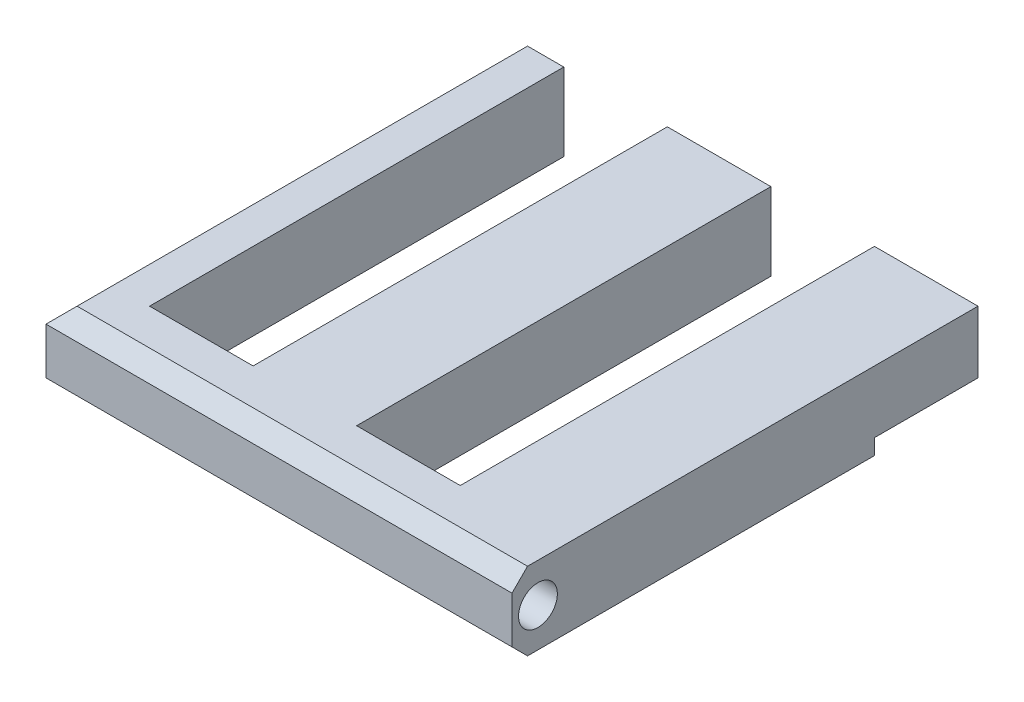
ISO-10303-21;
HEADER;
FILE_DESCRIPTION(('STEP AP214'),'2;1');
FILE_NAME('part.step','',(''),(''),'','','');
FILE_SCHEMA(('AUTOMOTIVE_DESIGN { 1 0 10303 214 1 1 1 1 }'));
ENDSEC;
DATA;
#1=APPLICATION_CONTEXT('core data for automotive mechanical design processes');
#2=APPLICATION_PROTOCOL_DEFINITION('international standard','automotive_design',2000,#1);
#3=PRODUCT_CONTEXT('',#1,'mechanical');
#4=PRODUCT('Part','Part','',(#3));
#5=PRODUCT_RELATED_PRODUCT_CATEGORY('part','',(#4));
#6=PRODUCT_DEFINITION_FORMATION('','',#4);
#7=PRODUCT_DEFINITION_CONTEXT('part definition',#1,'design');
#8=PRODUCT_DEFINITION('design','',#6,#7);
#9=PRODUCT_DEFINITION_SHAPE('','',#8);
#10=(LENGTH_UNIT() NAMED_UNIT(*) SI_UNIT(.MILLI.,.METRE.));
#11=(NAMED_UNIT(*) PLANE_ANGLE_UNIT() SI_UNIT($,.RADIAN.));
#12=(NAMED_UNIT(*) SI_UNIT($,.STERADIAN.) SOLID_ANGLE_UNIT());
#13=UNCERTAINTY_MEASURE_WITH_UNIT(LENGTH_MEASURE(1.E-05),#10,'distance_accuracy_value','');
#14=(GEOMETRIC_REPRESENTATION_CONTEXT(3) GLOBAL_UNCERTAINTY_ASSIGNED_CONTEXT((#13)) GLOBAL_UNIT_ASSIGNED_CONTEXT((#10,
#11,#12)) REPRESENTATION_CONTEXT('',''));
#15=CARTESIAN_POINT('',(0.,0.,0.));
#16=DIRECTION('',(0.,0.,1.));
#17=DIRECTION('',(1.,0.,0.));
#18=AXIS2_PLACEMENT_3D('',#15,#16,#17);
#19=CARTESIAN_POINT('',(0.,38.1,0.));
#20=DIRECTION('',(-1.,0.,0.));
#21=DIRECTION('',(0.,0.,1.));
#22=AXIS2_PLACEMENT_3D('',#19,#20,#21);
#23=PLANE('',#22);
#24=CARTESIAN_POINT('',(0.,19.05,-12.7289710029541));
#25=DIRECTION('',(1.,0.,0.));
#26=DIRECTION('',(0.,0.,-1.));
#27=AXIS2_PLACEMENT_3D('',#24,#25,#26);
#28=CIRCLE('',#27,9.525);
#29=CARTESIAN_POINT('',(0.,19.05,-22.2539710029541));
#30=VERTEX_POINT('',#29);
#31=EDGE_CURVE('E195',#30,#30,#28,.T.);
#32=ORIENTED_EDGE('',*,*,#31,.F.);
#33=EDGE_LOOP('',(#32));
#34=FACE_BOUND('',#33,.T.);
#35=DIRECTION('',(0.,0.,-1.));
#36=VECTOR('',#35,1.);
#37=CARTESIAN_POINT('',(0.,38.1,0.));
#38=LINE('',#37,#36);
#39=CARTESIAN_POINT('',(0.,38.1,-7.62000000000004));
#40=VERTEX_POINT('',#39);
#41=CARTESIAN_POINT('',(0.,38.1,-228.6));
#42=VERTEX_POINT('',#41);
#43=EDGE_CURVE('E225',#40,#42,#38,.T.);
#44=ORIENTED_EDGE('',*,*,#43,.F.);
#45=DIRECTION('',(0.,0.707106781186545,-0.70710678118655));
#46=VECTOR('',#45,1.);
#47=CARTESIAN_POINT('',(0.,30.48,0.));
#48=LINE('',#47,#46);
#49=CARTESIAN_POINT('',(0.,30.48,0.));
#50=VERTEX_POINT('',#49);
#51=EDGE_CURVE('E289',#40,#50,#48,.F.);
#52=ORIENTED_EDGE('',*,*,#51,.T.);
#53=DIRECTION('',(0.,-1.,0.));
#54=VECTOR('',#53,1.);
#55=CARTESIAN_POINT('',(0.,38.1,0.));
#56=LINE('',#55,#54);
#57=CARTESIAN_POINT('',(0.,7.62000000000005,0.));
#58=VERTEX_POINT('',#57);
#59=EDGE_CURVE('E251',#50,#58,#56,.T.);
#60=ORIENTED_EDGE('',*,*,#59,.T.);
#61=DIRECTION('',(0.,-0.70710678118655,-0.707106781186545));
#62=VECTOR('',#61,1.);
#63=CARTESIAN_POINT('',(0.,0.,-7.61999999999999));
#64=LINE('',#63,#62);
#65=CARTESIAN_POINT('',(0.,0.,-7.61999999999999));
#66=VERTEX_POINT('',#65);
#67=EDGE_CURVE('E287',#58,#66,#64,.T.);
#68=ORIENTED_EDGE('',*,*,#67,.T.);
#69=DIRECTION('',(0.,0.,-1.));
#70=VECTOR('',#69,1.);
#71=CARTESIAN_POINT('',(0.,0.,0.));
#72=LINE('',#71,#70);
#73=CARTESIAN_POINT('',(0.,0.,-177.771028997046));
#74=VERTEX_POINT('',#73);
#75=EDGE_CURVE('E245',#66,#74,#72,.T.);
#76=ORIENTED_EDGE('',*,*,#75,.T.);
#77=DIRECTION('',(0.,1.,0.));
#78=VECTOR('',#77,1.);
#79=CARTESIAN_POINT('',(0.,38.0999999999999,-177.771028997046));
#80=LINE('',#79,#78);
#81=CARTESIAN_POINT('',(0.,7.61999999999994,-177.771028997046));
#82=VERTEX_POINT('',#81);
#83=EDGE_CURVE('E192',#74,#82,#80,.T.);
#84=ORIENTED_EDGE('',*,*,#83,.T.);
#85=DIRECTION('',(0.,0.,1.));
#86=VECTOR('',#85,1.);
#87=CARTESIAN_POINT('',(0.,7.61999999999994,-177.771028997046));
#88=LINE('',#87,#86);
#89=CARTESIAN_POINT('',(0.,7.61999999999991,-228.6));
#90=VERTEX_POINT('',#89);
#91=EDGE_CURVE('E179',#90,#82,#88,.T.);
#92=ORIENTED_EDGE('',*,*,#91,.F.);
#93=DIRECTION('',(0.,-1.,0.));
#94=VECTOR('',#93,1.);
#95=CARTESIAN_POINT('',(0.,38.1,-228.6));
#96=LINE('',#95,#94);
#97=EDGE_CURVE('E170',#42,#90,#96,.T.);
#98=ORIENTED_EDGE('',*,*,#97,.F.);
#99=EDGE_LOOP('',(#44,#52,#60,#68,#76,#84,#92,#98));
#100=FACE_BOUND('',#99,.T.);
#101=ADVANCED_FACE('F37',(#34,#100),#23,.F.);
#102=CARTESIAN_POINT('',(-50.8,38.1,0.));
#103=DIRECTION('',(-1.,0.,0.));
#104=DIRECTION('',(0.,0.,1.));
#105=AXIS2_PLACEMENT_3D('',#102,#103,#104);
#106=PLANE('',#105);
#107=DIRECTION('',(0.,1.,0.));
#108=VECTOR('',#107,1.);
#109=CARTESIAN_POINT('',(-50.8,38.0999999999999,-177.771028997046));
#110=LINE('',#109,#108);
#111=CARTESIAN_POINT('',(-50.8,0.,-177.771028997046));
#112=VERTEX_POINT('',#111);
#113=CARTESIAN_POINT('',(-50.8,7.61999999999995,-177.771028997046));
#114=VERTEX_POINT('',#113);
#115=EDGE_CURVE('E276',#112,#114,#110,.T.);
#116=ORIENTED_EDGE('',*,*,#115,.F.);
#117=DIRECTION('',(0.,0.,-1.));
#118=VECTOR('',#117,1.);
#119=CARTESIAN_POINT('',(-50.8,0.,0.));
#120=LINE('',#119,#118);
#121=CARTESIAN_POINT('',(-50.8,0.,-25.4));
#122=VERTEX_POINT('',#121);
#123=EDGE_CURVE('E212',#122,#112,#120,.T.);
#124=ORIENTED_EDGE('',*,*,#123,.F.);
#125=DIRECTION('',(0.,-1.,0.));
#126=VECTOR('',#125,1.);
#127=CARTESIAN_POINT('',(-50.8,38.1,-25.4));
#128=LINE('',#127,#126);
#129=CARTESIAN_POINT('',(-50.8,38.1,-25.4));
#130=VERTEX_POINT('',#129);
#131=EDGE_CURVE('E171',#130,#122,#128,.T.);
#132=ORIENTED_EDGE('',*,*,#131,.F.);
#133=DIRECTION('',(0.,0.,-1.));
#134=VECTOR('',#133,1.);
#135=CARTESIAN_POINT('',(-50.8,38.1,0.));
#136=LINE('',#135,#134);
#137=CARTESIAN_POINT('',(-50.8,38.1,-228.6));
#138=VERTEX_POINT('',#137);
#139=EDGE_CURVE('E167',#130,#138,#136,.T.);
#140=ORIENTED_EDGE('',*,*,#139,.T.);
#141=DIRECTION('',(0.,-1.,0.));
#142=VECTOR('',#141,1.);
#143=CARTESIAN_POINT('',(-50.8,38.1,-228.6));
#144=LINE('',#143,#142);
#145=CARTESIAN_POINT('',(-50.8,7.61999999999992,-228.6));
#146=VERTEX_POINT('',#145);
#147=EDGE_CURVE('E160',#138,#146,#144,.T.);
#148=ORIENTED_EDGE('',*,*,#147,.T.);
#149=DIRECTION('',(0.,0.,-1.));
#150=VECTOR('',#149,1.);
#151=CARTESIAN_POINT('',(-50.8,7.61999999999995,-177.771028997046));
#152=LINE('',#151,#150);
#153=EDGE_CURVE('E164',#114,#146,#152,.T.);
#154=ORIENTED_EDGE('',*,*,#153,.F.);
#155=EDGE_LOOP('',(#116,#124,#132,#140,#148,#154));
#156=FACE_BOUND('',#155,.T.);
#157=ADVANCED_FACE('F162',(#156),#106,.T.);
#158=CARTESIAN_POINT('',(0.,0.,0.));
#159=DIRECTION('',(0.,1.,0.));
#160=DIRECTION('',(0.,0.,1.));
#161=AXIS2_PLACEMENT_3D('',#158,#159,#160);
#162=PLANE('',#161);
#163=ORIENTED_EDGE('',*,*,#75,.F.);
#164=DIRECTION('',(-1.,0.,0.));
#165=VECTOR('',#164,1.);
#166=CARTESIAN_POINT('',(-228.6,0.,-7.61999999999997));
#167=LINE('',#166,#165);
#168=CARTESIAN_POINT('',(-220.98,0.,-7.61999999999997));
#169=VERTEX_POINT('',#168);
#170=EDGE_CURVE('E11',#66,#169,#167,.T.);
#171=ORIENTED_EDGE('',*,*,#170,.T.);
#172=DIRECTION('',(0.,0.,-1.));
#173=VECTOR('',#172,1.);
#174=CARTESIAN_POINT('',(-220.98,0.,-228.6));
#175=LINE('',#174,#173);
#176=CARTESIAN_POINT('',(-220.98,0.,-228.6));
#177=VERTEX_POINT('',#176);
#178=EDGE_CURVE('E47',#169,#177,#175,.T.);
#179=ORIENTED_EDGE('',*,*,#178,.T.);
#180=DIRECTION('',(-1.,0.,0.));
#181=VECTOR('',#180,1.);
#182=CARTESIAN_POINT('',(0.,0.,-228.6));
#183=LINE('',#182,#181);
#184=CARTESIAN_POINT('',(-203.2,0.,-228.6));
#185=VERTEX_POINT('',#184);
#186=EDGE_CURVE('E243',#185,#177,#183,.T.);
#187=ORIENTED_EDGE('',*,*,#186,.F.);
#188=DIRECTION('',(0.,0.,-1.));
#189=VECTOR('',#188,1.);
#190=CARTESIAN_POINT('',(-203.2,0.,0.));
#191=LINE('',#190,#189);
#192=CARTESIAN_POINT('',(-203.2,0.,-25.4));
#193=VERTEX_POINT('',#192);
#194=EDGE_CURVE('E241',#193,#185,#191,.T.);
#195=ORIENTED_EDGE('',*,*,#194,.F.);
#196=DIRECTION('',(-1.,0.,0.));
#197=VECTOR('',#196,1.);
#198=CARTESIAN_POINT('',(0.,0.,-25.4));
#199=LINE('',#198,#197);
#200=CARTESIAN_POINT('',(-152.4,0.,-25.4));
#201=VERTEX_POINT('',#200);
#202=EDGE_CURVE('E233',#201,#193,#199,.T.);
#203=ORIENTED_EDGE('',*,*,#202,.F.);
#204=DIRECTION('',(0.,0.,-1.));
#205=VECTOR('',#204,1.);
#206=CARTESIAN_POINT('',(-152.4,0.,0.));
#207=LINE('',#206,#205);
#208=CARTESIAN_POINT('',(-152.4,0.,-228.6));
#209=VERTEX_POINT('',#208);
#210=EDGE_CURVE('E238',#201,#209,#207,.T.);
#211=ORIENTED_EDGE('',*,*,#210,.T.);
#212=DIRECTION('',(-1.,0.,0.));
#213=VECTOR('',#212,1.);
#214=CARTESIAN_POINT('',(0.,0.,-228.6));
#215=LINE('',#214,#213);
#216=CARTESIAN_POINT('',(-101.6,0.,-228.6));
#217=VERTEX_POINT('',#216);
#218=EDGE_CURVE('E235',#217,#209,#215,.T.);
#219=ORIENTED_EDGE('',*,*,#218,.F.);
#220=DIRECTION('',(0.,0.,-1.));
#221=VECTOR('',#220,1.);
#222=CARTESIAN_POINT('',(-101.6,0.,0.));
#223=LINE('',#222,#221);
#224=CARTESIAN_POINT('',(-101.6,0.,-25.4));
#225=VERTEX_POINT('',#224);
#226=EDGE_CURVE('E232',#225,#217,#223,.T.);
#227=ORIENTED_EDGE('',*,*,#226,.F.);
#228=EDGE_CURVE('E205',#122,#225,#199,.T.);
#229=ORIENTED_EDGE('',*,*,#228,.F.);
#230=ORIENTED_EDGE('',*,*,#123,.T.);
#231=DIRECTION('',(-1.,0.,0.));
#232=VECTOR('',#231,1.);
#233=CARTESIAN_POINT('',(0.,0.,-177.771028997046));
#234=LINE('',#233,#232);
#235=EDGE_CURVE('E189',#74,#112,#234,.T.);
#236=ORIENTED_EDGE('',*,*,#235,.F.);
#237=EDGE_LOOP('',(#163,#171,#179,#187,#195,#203,#211,#219,#227,#229,#230,#236));
#238=FACE_BOUND('',#237,.T.);
#239=ADVANCED_FACE('F348',(#238),#162,.F.);
#240=CARTESIAN_POINT('',(0.,38.1,-25.4));
#241=DIRECTION('',(0.,0.,1.));
#242=DIRECTION('',(1.,0.,0.));
#243=AXIS2_PLACEMENT_3D('',#240,#241,#242);
#244=PLANE('',#243);
#245=ORIENTED_EDGE('',*,*,#228,.T.);
#246=DIRECTION('',(0.,-1.,0.));
#247=VECTOR('',#246,1.);
#248=CARTESIAN_POINT('',(-101.6,38.1,-25.4));
#249=LINE('',#248,#247);
#250=CARTESIAN_POINT('',(-101.6,38.1,-25.4));
#251=VERTEX_POINT('',#250);
#252=EDGE_CURVE('E273',#251,#225,#249,.T.);
#253=ORIENTED_EDGE('',*,*,#252,.F.);
#254=DIRECTION('',(-1.,0.,0.));
#255=VECTOR('',#254,1.);
#256=CARTESIAN_POINT('',(0.,38.1,-25.4));
#257=LINE('',#256,#255);
#258=EDGE_CURVE('E208',#130,#251,#257,.T.);
#259=ORIENTED_EDGE('',*,*,#258,.F.);
#260=ORIENTED_EDGE('',*,*,#131,.T.);
#261=EDGE_LOOP('',(#245,#253,#259,#260));
#262=FACE_BOUND('',#261,.T.);
#263=ADVANCED_FACE('F325',(#262),#244,.F.);
#264=CARTESIAN_POINT('',(-101.6,38.1,0.));
#265=DIRECTION('',(-1.,0.,0.));
#266=DIRECTION('',(0.,0.,1.));
#267=AXIS2_PLACEMENT_3D('',#264,#265,#266);
#268=PLANE('',#267);
#269=ORIENTED_EDGE('',*,*,#226,.T.);
#270=DIRECTION('',(0.,-1.,0.));
#271=VECTOR('',#270,1.);
#272=CARTESIAN_POINT('',(-101.6,38.1,-228.6));
#273=LINE('',#272,#271);
#274=CARTESIAN_POINT('',(-101.6,38.1,-228.6));
#275=VERTEX_POINT('',#274);
#276=EDGE_CURVE('E270',#275,#217,#273,.T.);
#277=ORIENTED_EDGE('',*,*,#276,.F.);
#278=DIRECTION('',(0.,0.,-1.));
#279=VECTOR('',#278,1.);
#280=CARTESIAN_POINT('',(-101.6,38.1,0.));
#281=LINE('',#280,#279);
#282=EDGE_CURVE('E211',#251,#275,#281,.T.);
#283=ORIENTED_EDGE('',*,*,#282,.F.);
#284=ORIENTED_EDGE('',*,*,#252,.T.);
#285=EDGE_LOOP('',(#269,#277,#283,#284));
#286=FACE_BOUND('',#285,.T.);
#287=ADVANCED_FACE('F328',(#286),#268,.F.);
#288=CARTESIAN_POINT('',(0.,38.1,-228.6));
#289=DIRECTION('',(0.,0.,1.));
#290=DIRECTION('',(1.,0.,0.));
#291=AXIS2_PLACEMENT_3D('',#288,#289,#290);
#292=PLANE('',#291);
#293=ORIENTED_EDGE('',*,*,#218,.T.);
#294=DIRECTION('',(0.,-1.,0.));
#295=VECTOR('',#294,1.);
#296=CARTESIAN_POINT('',(-152.4,38.1,-228.6));
#297=LINE('',#296,#295);
#298=CARTESIAN_POINT('',(-152.4,38.1,-228.6));
#299=VERTEX_POINT('',#298);
#300=EDGE_CURVE('E268',#299,#209,#297,.T.);
#301=ORIENTED_EDGE('',*,*,#300,.F.);
#302=DIRECTION('',(-1.,0.,0.));
#303=VECTOR('',#302,1.);
#304=CARTESIAN_POINT('',(0.,38.1,-228.6));
#305=LINE('',#304,#303);
#306=EDGE_CURVE('E215',#275,#299,#305,.T.);
#307=ORIENTED_EDGE('',*,*,#306,.F.);
#308=ORIENTED_EDGE('',*,*,#276,.T.);
#309=EDGE_LOOP('',(#293,#301,#307,#308));
#310=FACE_BOUND('',#309,.T.);
#311=ADVANCED_FACE('F333',(#310),#292,.F.);
#312=CARTESIAN_POINT('',(-152.4,38.1,0.));
#313=DIRECTION('',(-1.,0.,0.));
#314=DIRECTION('',(0.,0.,1.));
#315=AXIS2_PLACEMENT_3D('',#312,#313,#314);
#316=PLANE('',#315);
#317=ORIENTED_EDGE('',*,*,#210,.F.);
#318=DIRECTION('',(0.,-1.,0.));
#319=VECTOR('',#318,1.);
#320=CARTESIAN_POINT('',(-152.4,38.1,-25.4));
#321=LINE('',#320,#319);
#322=CARTESIAN_POINT('',(-152.4,38.1,-25.4));
#323=VERTEX_POINT('',#322);
#324=EDGE_CURVE('E266',#323,#201,#321,.T.);
#325=ORIENTED_EDGE('',*,*,#324,.F.);
#326=DIRECTION('',(0.,0.,-1.));
#327=VECTOR('',#326,1.);
#328=CARTESIAN_POINT('',(-152.4,38.1,0.));
#329=LINE('',#328,#327);
#330=EDGE_CURVE('E217',#323,#299,#329,.T.);
#331=ORIENTED_EDGE('',*,*,#330,.T.);
#332=ORIENTED_EDGE('',*,*,#300,.T.);
#333=EDGE_LOOP('',(#317,#325,#331,#332));
#334=FACE_BOUND('',#333,.T.);
#335=ADVANCED_FACE('F339',(#334),#316,.T.);
#336=ORIENTED_EDGE('',*,*,#202,.T.);
#337=DIRECTION('',(0.,-1.,0.));
#338=VECTOR('',#337,1.);
#339=CARTESIAN_POINT('',(-203.2,38.1,-25.4));
#340=LINE('',#339,#338);
#341=CARTESIAN_POINT('',(-203.2,38.1,-25.4));
#342=VERTEX_POINT('',#341);
#343=EDGE_CURVE('E263',#342,#193,#340,.T.);
#344=ORIENTED_EDGE('',*,*,#343,.F.);
#345=EDGE_CURVE('E213',#323,#342,#257,.T.);
#346=ORIENTED_EDGE('',*,*,#345,.F.);
#347=ORIENTED_EDGE('',*,*,#324,.T.);
#348=EDGE_LOOP('',(#336,#344,#346,#347));
#349=FACE_BOUND('',#348,.T.);
#350=ADVANCED_FACE('F342',(#349),#244,.F.);
#351=CARTESIAN_POINT('',(-203.2,38.1,0.));
#352=DIRECTION('',(-1.,0.,0.));
#353=DIRECTION('',(0.,0.,1.));
#354=AXIS2_PLACEMENT_3D('',#351,#352,#353);
#355=PLANE('',#354);
#356=ORIENTED_EDGE('',*,*,#194,.T.);
#357=DIRECTION('',(0.,-1.,0.));
#358=VECTOR('',#357,1.);
#359=CARTESIAN_POINT('',(-203.2,38.1,-228.6));
#360=LINE('',#359,#358);
#361=CARTESIAN_POINT('',(-203.2,38.1,-228.6));
#362=VERTEX_POINT('',#361);
#363=EDGE_CURVE('E260',#362,#185,#360,.T.);
#364=ORIENTED_EDGE('',*,*,#363,.F.);
#365=DIRECTION('',(0.,0.,-1.));
#366=VECTOR('',#365,1.);
#367=CARTESIAN_POINT('',(-203.2,38.1,0.));
#368=LINE('',#367,#366);
#369=EDGE_CURVE('E220',#342,#362,#368,.T.);
#370=ORIENTED_EDGE('',*,*,#369,.F.);
#371=ORIENTED_EDGE('',*,*,#343,.T.);
#372=EDGE_LOOP('',(#356,#364,#370,#371));
#373=FACE_BOUND('',#372,.T.);
#374=ADVANCED_FACE('F345',(#373),#355,.F.);
#375=CARTESIAN_POINT('',(0.,38.1,-228.6));
#376=DIRECTION('',(0.,0.,1.));
#377=DIRECTION('',(1.,0.,0.));
#378=AXIS2_PLACEMENT_3D('',#375,#376,#377);
#379=PLANE('',#378);
#380=CARTESIAN_POINT('',(-215.9,19.05,-228.6));
#381=DIRECTION('',(0.,0.,-1.));
#382=DIRECTION('',(-1.,0.,0.));
#383=AXIS2_PLACEMENT_3D('',#380,#381,#382);
#384=CIRCLE('',#383,9.525);
#385=CARTESIAN_POINT('',(-225.425,19.05,-228.6));
#386=VERTEX_POINT('',#385);
#387=EDGE_CURVE('E199',#386,#386,#384,.T.);
#388=ORIENTED_EDGE('',*,*,#387,.F.);
#389=EDGE_LOOP('',(#388));
#390=FACE_BOUND('',#389,.T.);
#391=DIRECTION('',(0.,-1.,0.));
#392=VECTOR('',#391,1.);
#393=CARTESIAN_POINT('',(-228.6,38.1,-228.6));
#394=LINE('',#393,#392);
#395=CARTESIAN_POINT('',(-228.6,30.48,-228.6));
#396=VERTEX_POINT('',#395);
#397=CARTESIAN_POINT('',(-228.6,7.62000000000005,-228.6));
#398=VERTEX_POINT('',#397);
#399=EDGE_CURVE('E257',#396,#398,#394,.T.);
#400=ORIENTED_EDGE('',*,*,#399,.F.);
#401=DIRECTION('',(-0.707106781186549,-0.707106781186546,0.));
#402=VECTOR('',#401,1.);
#403=CARTESIAN_POINT('',(-228.6,30.48,-228.6));
#404=LINE('',#403,#402);
#405=CARTESIAN_POINT('',(-220.98,38.1,-228.6));
#406=VERTEX_POINT('',#405);
#407=EDGE_CURVE('E297',#396,#406,#404,.F.);
#408=ORIENTED_EDGE('',*,*,#407,.T.);
#409=DIRECTION('',(-1.,0.,0.));
#410=VECTOR('',#409,1.);
#411=CARTESIAN_POINT('',(0.,38.1,-228.6));
#412=LINE('',#411,#410);
#413=EDGE_CURVE('E222',#362,#406,#412,.T.);
#414=ORIENTED_EDGE('',*,*,#413,.F.);
#415=ORIENTED_EDGE('',*,*,#363,.T.);
#416=ORIENTED_EDGE('',*,*,#186,.T.);
#417=DIRECTION('',(-0.707106781186544,0.707106781186551,0.));
#418=VECTOR('',#417,1.);
#419=CARTESIAN_POINT('',(-220.98,0.,-228.6));
#420=LINE('',#419,#418);
#421=EDGE_CURVE('E295',#177,#398,#420,.T.);
#422=ORIENTED_EDGE('',*,*,#421,.T.);
#423=EDGE_LOOP('',(#400,#408,#414,#415,#416,#422));
#424=FACE_BOUND('',#423,.T.);
#425=ADVANCED_FACE('F303',(#390,#424),#379,.F.);
#426=CARTESIAN_POINT('',(-228.6,38.1,0.));
#427=DIRECTION('',(-1.,0.,0.));
#428=DIRECTION('',(0.,0.,1.));
#429=AXIS2_PLACEMENT_3D('',#426,#427,#428);
#430=PLANE('',#429);
#431=DIRECTION('',(0.,-1.,0.));
#432=VECTOR('',#431,1.);
#433=CARTESIAN_POINT('',(-228.6,38.1,0.));
#434=LINE('',#433,#432);
#435=CARTESIAN_POINT('',(-228.6,30.48,0.));
#436=VERTEX_POINT('',#435);
#437=CARTESIAN_POINT('',(-228.6,7.62000000000005,0.));
#438=VERTEX_POINT('',#437);
#439=EDGE_CURVE('E254',#436,#438,#434,.T.);
#440=ORIENTED_EDGE('',*,*,#439,.F.);
#441=DIRECTION('',(0.,0.,-1.));
#442=VECTOR('',#441,1.);
#443=CARTESIAN_POINT('',(-228.6,30.48,0.));
#444=LINE('',#443,#442);
#445=EDGE_CURVE('E293',#436,#396,#444,.T.);
#446=ORIENTED_EDGE('',*,*,#445,.T.);
#447=ORIENTED_EDGE('',*,*,#399,.T.);
#448=DIRECTION('',(0.,0.,1.));
#449=VECTOR('',#448,1.);
#450=CARTESIAN_POINT('',(-228.6,7.62000000000004,0.));
#451=LINE('',#450,#449);
#452=EDGE_CURVE('E291',#398,#438,#451,.T.);
#453=ORIENTED_EDGE('',*,*,#452,.T.);
#454=EDGE_LOOP('',(#440,#446,#447,#453));
#455=FACE_BOUND('',#454,.T.);
#456=ADVANCED_FACE('F360',(#455),#430,.T.);
#457=CARTESIAN_POINT('',(0.,38.1,0.));
#458=DIRECTION('',(0.,0.,1.));
#459=DIRECTION('',(1.,0.,0.));
#460=AXIS2_PLACEMENT_3D('',#457,#458,#459);
#461=PLANE('',#460);
#462=ORIENTED_EDGE('',*,*,#59,.F.);
#463=DIRECTION('',(-1.,0.,0.));
#464=VECTOR('',#463,1.);
#465=CARTESIAN_POINT('',(0.,30.48,0.));
#466=LINE('',#465,#464);
#467=EDGE_CURVE('E280',#50,#436,#466,.T.);
#468=ORIENTED_EDGE('',*,*,#467,.T.);
#469=ORIENTED_EDGE('',*,*,#439,.T.);
#470=DIRECTION('',(1.,0.,0.));
#471=VECTOR('',#470,1.);
#472=CARTESIAN_POINT('',(0.,7.62000000000004,0.));
#473=LINE('',#472,#471);
#474=EDGE_CURVE('E278',#438,#58,#473,.T.);
#475=ORIENTED_EDGE('',*,*,#474,.T.);
#476=EDGE_LOOP('',(#462,#468,#469,#475));
#477=FACE_BOUND('',#476,.T.);
#478=ADVANCED_FACE('F357',(#477),#461,.T.);
#479=CARTESIAN_POINT('',(0.,38.1,-228.6));
#480=DIRECTION('',(0.,0.,1.));
#481=DIRECTION('',(1.,0.,0.));
#482=AXIS2_PLACEMENT_3D('',#479,#480,#481);
#483=PLANE('',#482);
#484=ORIENTED_EDGE('',*,*,#97,.T.);
#485=DIRECTION('',(1.,0.,0.));
#486=VECTOR('',#485,1.);
#487=CARTESIAN_POINT('',(-50.8,7.61999999999992,-228.6));
#488=LINE('',#487,#486);
#489=EDGE_CURVE('E174',#146,#90,#488,.T.);
#490=ORIENTED_EDGE('',*,*,#489,.F.);
#491=ORIENTED_EDGE('',*,*,#147,.F.);
#492=DIRECTION('',(-1.,0.,0.));
#493=VECTOR('',#492,1.);
#494=CARTESIAN_POINT('',(0.,38.1,-228.6));
#495=LINE('',#494,#493);
#496=EDGE_CURVE('E227',#42,#138,#495,.T.);
#497=ORIENTED_EDGE('',*,*,#496,.F.);
#498=EDGE_LOOP('',(#484,#490,#491,#497));
#499=FACE_BOUND('',#498,.T.);
#500=ADVANCED_FACE('F175',(#499),#483,.F.);
#501=CARTESIAN_POINT('',(0.,38.1,0.));
#502=DIRECTION('',(0.,1.,0.));
#503=DIRECTION('',(0.,0.,1.));
#504=AXIS2_PLACEMENT_3D('',#501,#502,#503);
#505=PLANE('',#504);
#506=DIRECTION('',(0.,0.,1.));
#507=VECTOR('',#506,1.);
#508=CARTESIAN_POINT('',(-220.98,38.1,0.));
#509=LINE('',#508,#507);
#510=CARTESIAN_POINT('',(-220.98,38.1,-7.62000000000002));
#511=VERTEX_POINT('',#510);
#512=EDGE_CURVE('E283',#406,#511,#509,.T.);
#513=ORIENTED_EDGE('',*,*,#512,.T.);
#514=DIRECTION('',(1.,0.,0.));
#515=VECTOR('',#514,1.);
#516=CARTESIAN_POINT('',(0.,38.1,-7.62000000000004));
#517=LINE('',#516,#515);
#518=EDGE_CURVE('E285',#511,#40,#517,.T.);
#519=ORIENTED_EDGE('',*,*,#518,.T.);
#520=ORIENTED_EDGE('',*,*,#43,.T.);
#521=ORIENTED_EDGE('',*,*,#496,.T.);
#522=ORIENTED_EDGE('',*,*,#139,.F.);
#523=ORIENTED_EDGE('',*,*,#258,.T.);
#524=ORIENTED_EDGE('',*,*,#282,.T.);
#525=ORIENTED_EDGE('',*,*,#306,.T.);
#526=ORIENTED_EDGE('',*,*,#330,.F.);
#527=ORIENTED_EDGE('',*,*,#345,.T.);
#528=ORIENTED_EDGE('',*,*,#369,.T.);
#529=ORIENTED_EDGE('',*,*,#413,.T.);
#530=EDGE_LOOP('',(#513,#519,#520,#521,#522,#523,#524,#525,#526,#527,#528,#529));
#531=FACE_BOUND('',#530,.T.);
#532=ADVANCED_FACE('F308',(#531),#505,.T.);
#533=CARTESIAN_POINT('',(-215.9,19.05,-190.5));
#534=DIRECTION('',(0.,0.,-1.));
#535=DIRECTION('',(-1.,0.,0.));
#536=AXIS2_PLACEMENT_3D('',#533,#534,#535);
#537=CYLINDRICAL_SURFACE('',#536,9.525);
#538=CARTESIAN_POINT('',(-215.9,19.05,-190.5));
#539=DIRECTION('',(0.,0.,-1.));
#540=DIRECTION('',(-1.,0.,0.));
#541=AXIS2_PLACEMENT_3D('',#538,#539,#540);
#542=CIRCLE('',#541,9.525);
#543=CARTESIAN_POINT('',(-225.425,19.05,-190.5));
#544=VERTEX_POINT('',#543);
#545=EDGE_CURVE('E202',#544,#544,#542,.T.);
#546=CARTESIAN_POINT('',(-225.425,19.05,-190.5));
#547=CARTESIAN_POINT('',(-225.425,19.05,-190.896875));
#548=CARTESIAN_POINT('',(-225.425,19.05,-191.29375));
#549=CARTESIAN_POINT('',(-225.425,19.05,-192.0875));
#550=CARTESIAN_POINT('',(-225.425,19.05,-192.484375));
#551=CARTESIAN_POINT('',(-225.425,19.05,-193.278125));
#552=CARTESIAN_POINT('',(-225.425,19.05,-193.675));
#553=CARTESIAN_POINT('',(-225.425,19.05,-194.46875));
#554=CARTESIAN_POINT('',(-225.425,19.05,-194.865625));
#555=CARTESIAN_POINT('',(-225.425,19.05,-195.659375));
#556=CARTESIAN_POINT('',(-225.425,19.05,-196.05625));
#557=CARTESIAN_POINT('',(-225.425,19.05,-196.85));
#558=CARTESIAN_POINT('',(-225.425,19.05,-197.246875));
#559=CARTESIAN_POINT('',(-225.425,19.05,-198.040625));
#560=CARTESIAN_POINT('',(-225.425,19.05,-198.4375));
#561=CARTESIAN_POINT('',(-225.425,19.05,-199.23125));
#562=CARTESIAN_POINT('',(-225.425,19.05,-199.628125));
#563=CARTESIAN_POINT('',(-225.425,19.05,-200.421875));
#564=CARTESIAN_POINT('',(-225.425,19.05,-200.81875));
#565=CARTESIAN_POINT('',(-225.425,19.05,-201.6125));
#566=CARTESIAN_POINT('',(-225.425,19.05,-202.009375));
#567=CARTESIAN_POINT('',(-225.425,19.05,-202.803125));
#568=CARTESIAN_POINT('',(-225.425,19.05,-203.2));
#569=CARTESIAN_POINT('',(-225.425,19.05,-203.99375));
#570=CARTESIAN_POINT('',(-225.425,19.05,-204.390625));
#571=CARTESIAN_POINT('',(-225.425,19.05,-205.184375));
#572=CARTESIAN_POINT('',(-225.425,19.05,-205.58125));
#573=CARTESIAN_POINT('',(-225.425,19.05,-206.375));
#574=CARTESIAN_POINT('',(-225.425,19.05,-206.771875));
#575=CARTESIAN_POINT('',(-225.425,19.05,-207.565625));
#576=CARTESIAN_POINT('',(-225.425,19.05,-207.9625));
#577=CARTESIAN_POINT('',(-225.425,19.05,-208.75625));
#578=CARTESIAN_POINT('',(-225.425,19.05,-209.153125));
#579=CARTESIAN_POINT('',(-225.425,19.05,-209.946875));
#580=CARTESIAN_POINT('',(-225.425,19.05,-210.34375));
#581=CARTESIAN_POINT('',(-225.425,19.05,-211.1375));
#582=CARTESIAN_POINT('',(-225.425,19.05,-211.534375));
#583=CARTESIAN_POINT('',(-225.425,19.05,-212.328125));
#584=CARTESIAN_POINT('',(-225.425,19.05,-212.725));
#585=CARTESIAN_POINT('',(-225.425,19.05,-213.51875));
#586=CARTESIAN_POINT('',(-225.425,19.05,-213.915625));
#587=CARTESIAN_POINT('',(-225.425,19.05,-214.709375));
#588=CARTESIAN_POINT('',(-225.425,19.05,-215.10625));
#589=CARTESIAN_POINT('',(-225.425,19.05,-215.9));
#590=CARTESIAN_POINT('',(-225.425,19.05,-216.296875));
#591=CARTESIAN_POINT('',(-225.425,19.05,-217.090625));
#592=CARTESIAN_POINT('',(-225.425,19.05,-217.4875));
#593=CARTESIAN_POINT('',(-225.425,19.05,-218.28125));
#594=CARTESIAN_POINT('',(-225.425,19.05,-218.678125));
#595=CARTESIAN_POINT('',(-225.425,19.05,-219.471875));
#596=CARTESIAN_POINT('',(-225.425,19.05,-219.86875));
#597=CARTESIAN_POINT('',(-225.425,19.05,-220.6625));
#598=CARTESIAN_POINT('',(-225.425,19.05,-221.059375));
#599=CARTESIAN_POINT('',(-225.425,19.05,-221.853125));
#600=CARTESIAN_POINT('',(-225.425,19.05,-222.25));
#601=CARTESIAN_POINT('',(-225.425,19.05,-223.04375));
#602=CARTESIAN_POINT('',(-225.425,19.05,-223.440625));
#603=CARTESIAN_POINT('',(-225.425,19.05,-224.234375));
#604=CARTESIAN_POINT('',(-225.425,19.05,-224.63125));
#605=CARTESIAN_POINT('',(-225.425,19.05,-225.425));
#606=CARTESIAN_POINT('',(-225.425,19.05,-225.821875));
#607=CARTESIAN_POINT('',(-225.425,19.05,-226.615625));
#608=CARTESIAN_POINT('',(-225.425,19.05,-227.0125));
#609=CARTESIAN_POINT('',(-225.425,19.05,-227.80625));
#610=CARTESIAN_POINT('',(-225.425,19.05,-228.203125));
#611=CARTESIAN_POINT('',(-225.425,19.05,-228.6));
#612=B_SPLINE_CURVE_WITH_KNOTS('',3,(#546,#547,#548,#549,#550,#551,#552,#553,#554,#555,#556,
#557,#558,#559,#560,#561,#562,#563,#564,#565,#566,#567,#568,#569,#570,#571,#572,#573,#574,#575,
#576,#577,#578,#579,#580,#581,#582,#583,#584,#585,#586,#587,#588,#589,#590,#591,#592,#593,#594,
#595,#596,#597,#598,#599,#600,#601,#602,#603,#604,#605,#606,#607,#608,#609,#610,#611),
.UNSPECIFIED.,.F.,.F.,(4,2,2,2,2,2,2,2,2,2,2,2,2,2,2,2,2,2,2,2,2,2,2,2,2,2,2,2,2,2,2,2,4),(0.,
1.190625,2.38125,3.571875,4.7625,5.953125,7.14375,8.334375,9.52500000000001,10.715625,11.90625,
13.096875,14.2875,15.478125,16.66875,17.859375,19.05,20.240625,21.43125,22.621875,23.8125,
25.003125,26.19375,27.384375,28.575,29.765625,30.95625,32.146875,33.3375,34.528125,35.71875,
36.909375,38.1),.UNSPECIFIED.);
#613=EDGE_CURVE('BSEAM428',#544,#386,#612,.T.);
#614=ORIENTED_EDGE('',*,*,#545,.F.);
#615=ORIENTED_EDGE('',*,*,#387,.T.);
#616=ORIENTED_EDGE('',*,*,#613,.T.);
#617=ORIENTED_EDGE('',*,*,#613,.F.);
#618=EDGE_LOOP('',(#614,#616,#615,#617));
#619=FACE_BOUND('',#618,.T.);
#620=ADVANCED_FACE('F428',(#619),#537,.F.);
#621=CARTESIAN_POINT('',(-215.9,19.05,-190.5));
#622=DIRECTION('',(0.,0.,-1.));
#623=DIRECTION('',(-1.,0.,0.));
#624=AXIS2_PLACEMENT_3D('',#621,#622,#623);
#625=PLANE('',#624);
#626=ORIENTED_EDGE('',*,*,#545,.T.);
#627=EDGE_LOOP('',(#626));
#628=FACE_BOUND('',#627,.T.);
#629=ADVANCED_FACE('F424',(#628),#625,.T.);
#630=CARTESIAN_POINT('',(-38.1,19.05,-12.7289710029541));
#631=DIRECTION('',(1.,0.,0.));
#632=DIRECTION('',(0.,0.,-1.));
#633=AXIS2_PLACEMENT_3D('',#630,#631,#632);
#634=CYLINDRICAL_SURFACE('',#633,9.525);
#635=CARTESIAN_POINT('',(-38.1,19.05,-12.7289710029541));
#636=DIRECTION('',(1.,0.,0.));
#637=DIRECTION('',(0.,0.,-1.));
#638=AXIS2_PLACEMENT_3D('',#635,#636,#637);
#639=CIRCLE('',#638,9.525);
#640=CARTESIAN_POINT('',(-38.1,19.05,-22.2539710029541));
#641=VERTEX_POINT('',#640);
#642=EDGE_CURVE('E196',#641,#641,#639,.T.);
#643=CARTESIAN_POINT('',(-38.1,19.05,-22.2539710029541));
#644=CARTESIAN_POINT('',(-37.703125,19.05,-22.2539710029541));
#645=CARTESIAN_POINT('',(-37.30625,19.05,-22.2539710029541));
#646=CARTESIAN_POINT('',(-36.5125,19.05,-22.2539710029541));
#647=CARTESIAN_POINT('',(-36.115625,19.05,-22.2539710029541));
#648=CARTESIAN_POINT('',(-35.321875,19.05,-22.2539710029541));
#649=CARTESIAN_POINT('',(-34.925,19.05,-22.2539710029541));
#650=CARTESIAN_POINT('',(-34.13125,19.05,-22.2539710029541));
#651=CARTESIAN_POINT('',(-33.734375,19.05,-22.2539710029541));
#652=CARTESIAN_POINT('',(-32.940625,19.05,-22.2539710029541));
#653=CARTESIAN_POINT('',(-32.54375,19.05,-22.2539710029541));
#654=CARTESIAN_POINT('',(-31.75,19.05,-22.2539710029541));
#655=CARTESIAN_POINT('',(-31.353125,19.05,-22.2539710029541));
#656=CARTESIAN_POINT('',(-30.559375,19.05,-22.2539710029541));
#657=CARTESIAN_POINT('',(-30.1625,19.05,-22.2539710029541));
#658=CARTESIAN_POINT('',(-29.36875,19.05,-22.2539710029541));
#659=CARTESIAN_POINT('',(-28.971875,19.05,-22.2539710029541));
#660=CARTESIAN_POINT('',(-28.178125,19.05,-22.2539710029541));
#661=CARTESIAN_POINT('',(-27.78125,19.05,-22.2539710029541));
#662=CARTESIAN_POINT('',(-26.9875,19.05,-22.2539710029541));
#663=CARTESIAN_POINT('',(-26.590625,19.05,-22.2539710029541));
#664=CARTESIAN_POINT('',(-25.796875,19.05,-22.2539710029541));
#665=CARTESIAN_POINT('',(-25.4,19.05,-22.2539710029541));
#666=CARTESIAN_POINT('',(-24.60625,19.05,-22.2539710029541));
#667=CARTESIAN_POINT('',(-24.209375,19.05,-22.2539710029541));
#668=CARTESIAN_POINT('',(-23.415625,19.05,-22.2539710029541));
#669=CARTESIAN_POINT('',(-23.01875,19.05,-22.2539710029541));
#670=CARTESIAN_POINT('',(-22.225,19.05,-22.2539710029541));
#671=CARTESIAN_POINT('',(-21.828125,19.05,-22.2539710029541));
#672=CARTESIAN_POINT('',(-21.034375,19.05,-22.2539710029541));
#673=CARTESIAN_POINT('',(-20.6375,19.05,-22.2539710029541));
#674=CARTESIAN_POINT('',(-19.84375,19.05,-22.2539710029541));
#675=CARTESIAN_POINT('',(-19.446875,19.05,-22.2539710029541));
#676=CARTESIAN_POINT('',(-18.653125,19.05,-22.2539710029541));
#677=CARTESIAN_POINT('',(-18.25625,19.05,-22.2539710029541));
#678=CARTESIAN_POINT('',(-17.4625,19.05,-22.2539710029541));
#679=CARTESIAN_POINT('',(-17.065625,19.05,-22.2539710029541));
#680=CARTESIAN_POINT('',(-16.271875,19.05,-22.2539710029541));
#681=CARTESIAN_POINT('',(-15.875,19.05,-22.2539710029541));
#682=CARTESIAN_POINT('',(-15.08125,19.05,-22.2539710029541));
#683=CARTESIAN_POINT('',(-14.684375,19.05,-22.2539710029541));
#684=CARTESIAN_POINT('',(-13.890625,19.05,-22.2539710029541));
#685=CARTESIAN_POINT('',(-13.49375,19.05,-22.2539710029541));
#686=CARTESIAN_POINT('',(-12.7,19.05,-22.2539710029541));
#687=CARTESIAN_POINT('',(-12.303125,19.05,-22.2539710029541));
#688=CARTESIAN_POINT('',(-11.509375,19.05,-22.2539710029541));
#689=CARTESIAN_POINT('',(-11.1125,19.05,-22.2539710029541));
#690=CARTESIAN_POINT('',(-10.31875,19.05,-22.2539710029541));
#691=CARTESIAN_POINT('',(-9.92187499999999,19.05,-22.2539710029541));
#692=CARTESIAN_POINT('',(-9.128125,19.05,-22.2539710029541));
#693=CARTESIAN_POINT('',(-8.73124999999999,19.05,-22.2539710029541));
#694=CARTESIAN_POINT('',(-7.93749999999999,19.05,-22.2539710029541));
#695=CARTESIAN_POINT('',(-7.54062499999999,19.05,-22.2539710029541));
#696=CARTESIAN_POINT('',(-6.746875,19.05,-22.2539710029541));
#697=CARTESIAN_POINT('',(-6.35,19.05,-22.2539710029541));
#698=CARTESIAN_POINT('',(-5.55625,19.05,-22.2539710029541));
#699=CARTESIAN_POINT('',(-5.159375,19.05,-22.2539710029541));
#700=CARTESIAN_POINT('',(-4.365625,19.05,-22.2539710029541));
#701=CARTESIAN_POINT('',(-3.96875,19.05,-22.2539710029541));
#702=CARTESIAN_POINT('',(-3.175,19.05,-22.2539710029541));
#703=CARTESIAN_POINT('',(-2.778125,19.05,-22.2539710029541));
#704=CARTESIAN_POINT('',(-1.984375,19.05,-22.2539710029541));
#705=CARTESIAN_POINT('',(-1.5875,19.05,-22.2539710029541));
#706=CARTESIAN_POINT('',(-0.79375,19.05,-22.2539710029541));
#707=CARTESIAN_POINT('',(-0.396875,19.05,-22.2539710029541));
#708=CARTESIAN_POINT('',(0.,19.05,-22.2539710029541));
#709=B_SPLINE_CURVE_WITH_KNOTS('',3,(#643,#644,#645,#646,#647,#648,#649,#650,#651,#652,#653,
#654,#655,#656,#657,#658,#659,#660,#661,#662,#663,#664,#665,#666,#667,#668,#669,#670,#671,#672,
#673,#674,#675,#676,#677,#678,#679,#680,#681,#682,#683,#684,#685,#686,#687,#688,#689,#690,#691,
#692,#693,#694,#695,#696,#697,#698,#699,#700,#701,#702,#703,#704,#705,#706,#707,#708),
.UNSPECIFIED.,.F.,.F.,(4,2,2,2,2,2,2,2,2,2,2,2,2,2,2,2,2,2,2,2,2,2,2,2,2,2,2,2,2,2,2,2,4),(0.,
1.190625,2.38125,3.571875,4.7625,5.953125,7.14375,8.334375,9.52500000000001,10.715625,11.90625,
13.096875,14.2875,15.478125,16.66875,17.859375,19.05,20.240625,21.43125,22.621875,23.8125,
25.003125,26.19375,27.384375,28.575,29.765625,30.95625,32.146875,33.3375,34.528125,35.71875,
36.909375,38.1),.UNSPECIFIED.);
#710=EDGE_CURVE('BSEAM420',#641,#30,#709,.T.);
#711=ORIENTED_EDGE('',*,*,#642,.F.);
#712=ORIENTED_EDGE('',*,*,#31,.T.);
#713=ORIENTED_EDGE('',*,*,#710,.T.);
#714=ORIENTED_EDGE('',*,*,#710,.F.);
#715=EDGE_LOOP('',(#711,#713,#712,#714));
#716=FACE_BOUND('',#715,.T.);
#717=ADVANCED_FACE('F420',(#716),#634,.F.);
#718=CARTESIAN_POINT('',(-38.1,19.05,-12.7289710029541));
#719=DIRECTION('',(1.,0.,0.));
#720=DIRECTION('',(0.,0.,-1.));
#721=AXIS2_PLACEMENT_3D('',#718,#719,#720);
#722=PLANE('',#721);
#723=ORIENTED_EDGE('',*,*,#642,.T.);
#724=EDGE_LOOP('',(#723));
#725=FACE_BOUND('',#724,.T.);
#726=ADVANCED_FACE('F415',(#725),#722,.T.);
#727=CARTESIAN_POINT('',(177.799999999999,15.2399999999999,-177.771028997046));
#728=DIRECTION('',(0.,0.,1.));
#729=DIRECTION('',(0.,-1.,0.));
#730=AXIS2_PLACEMENT_3D('',#727,#728,#729);
#731=PLANE('',#730);
#732=ORIENTED_EDGE('',*,*,#115,.T.);
#733=DIRECTION('',(-1.,0.,0.));
#734=VECTOR('',#733,1.);
#735=CARTESIAN_POINT('',(-50.8,7.61999999999995,-177.771028997046));
#736=LINE('',#735,#734);
#737=EDGE_CURVE('E183',#82,#114,#736,.T.);
#738=ORIENTED_EDGE('',*,*,#737,.F.);
#739=ORIENTED_EDGE('',*,*,#83,.F.);
#740=ORIENTED_EDGE('',*,*,#235,.T.);
#741=EDGE_LOOP('',(#732,#738,#739,#740));
#742=FACE_BOUND('',#741,.T.);
#743=ADVANCED_FACE('F353',(#742),#731,.F.);
#744=CARTESIAN_POINT('',(0.,7.62000000000005,0.));
#745=DIRECTION('',(0.,-1.,0.));
#746=DIRECTION('',(0.,0.,-1.));
#747=AXIS2_PLACEMENT_3D('',#744,#745,#746);
#748=PLANE('',#747);
#749=ORIENTED_EDGE('',*,*,#153,.T.);
#750=ORIENTED_EDGE('',*,*,#489,.T.);
#751=ORIENTED_EDGE('',*,*,#91,.T.);
#752=ORIENTED_EDGE('',*,*,#737,.T.);
#753=EDGE_LOOP('',(#749,#750,#751,#752));
#754=FACE_BOUND('',#753,.T.);
#755=ADVANCED_FACE('F181',(#754),#748,.T.);
#756=CARTESIAN_POINT('',(-228.6,30.48,0.));
#757=DIRECTION('',(0.707106781186546,-0.707106781186549,0.));
#758=DIRECTION('',(0.,0.,-1.));
#759=AXIS2_PLACEMENT_3D('',#756,#757,#758);
#760=PLANE('',#759);
#761=ORIENTED_EDGE('',*,*,#407,.F.);
#762=ORIENTED_EDGE('',*,*,#445,.F.);
#763=DIRECTION('',(0.577350269189626,0.577350269189624,-0.577350269189628));
#764=VECTOR('',#763,1.);
#765=CARTESIAN_POINT('',(-228.6,30.48,0.));
#766=LINE('',#765,#764);
#767=EDGE_CURVE('E184',#511,#436,#766,.F.);
#768=ORIENTED_EDGE('',*,*,#767,.F.);
#769=ORIENTED_EDGE('',*,*,#512,.F.);
#770=EDGE_LOOP('',(#761,#762,#768,#769));
#771=FACE_BOUND('',#770,.T.);
#772=ADVANCED_FACE('F313',(#771),#760,.F.);
#773=CARTESIAN_POINT('',(0.,30.48,0.));
#774=DIRECTION('',(0.,-0.70710678118655,-0.707106781186545));
#775=DIRECTION('',(-1.,0.,0.));
#776=AXIS2_PLACEMENT_3D('',#773,#774,#775);
#777=PLANE('',#776);
#778=ORIENTED_EDGE('',*,*,#51,.F.);
#779=ORIENTED_EDGE('',*,*,#518,.F.);
#780=ORIENTED_EDGE('',*,*,#767,.T.);
#781=ORIENTED_EDGE('',*,*,#467,.F.);
#782=EDGE_LOOP('',(#778,#779,#780,#781));
#783=FACE_BOUND('',#782,.T.);
#784=ADVANCED_FACE('F317',(#783),#777,.F.);
#785=CARTESIAN_POINT('',(-220.98,0.,0.));
#786=DIRECTION('',(-0.707106781186551,-0.707106781186544,0.));
#787=DIRECTION('',(0.,0.,1.));
#788=AXIS2_PLACEMENT_3D('',#785,#786,#787);
#789=PLANE('',#788);
#790=ORIENTED_EDGE('',*,*,#421,.F.);
#791=ORIENTED_EDGE('',*,*,#178,.F.);
#792=DIRECTION('',(-0.577350269189623,0.577350269189629,0.577350269189625));
#793=VECTOR('',#792,1.);
#794=CARTESIAN_POINT('',(-223.52,2.53999999999999,-5.07999999999999));
#795=LINE('',#794,#793);
#796=EDGE_CURVE('E42',#438,#169,#795,.F.);
#797=ORIENTED_EDGE('',*,*,#796,.F.);
#798=ORIENTED_EDGE('',*,*,#452,.F.);
#799=EDGE_LOOP('',(#790,#791,#797,#798));
#800=FACE_BOUND('',#799,.T.);
#801=ADVANCED_FACE('F40',(#800),#789,.T.);
#802=CARTESIAN_POINT('',(0.,0.,-7.61999999999999));
#803=DIRECTION('',(0.,-0.707106781186545,0.70710678118655));
#804=DIRECTION('',(1.,0.,0.));
#805=AXIS2_PLACEMENT_3D('',#802,#803,#804);
#806=PLANE('',#805);
#807=ORIENTED_EDGE('',*,*,#67,.F.);
#808=ORIENTED_EDGE('',*,*,#474,.F.);
#809=ORIENTED_EDGE('',*,*,#796,.T.);
#810=ORIENTED_EDGE('',*,*,#170,.F.);
#811=EDGE_LOOP('',(#807,#808,#809,#810));
#812=FACE_BOUND('',#811,.T.);
#813=ADVANCED_FACE('F355',(#812),#806,.T.);
#814=CLOSED_SHELL('',(#101,#157,#239,#263,#287,#311,#335,#350,#374,#425,#456,#478,#500,#532,
#620,#629,#717,#726,#743,#755,#772,#784,#801,#813));
#815=MANIFOLD_SOLID_BREP('B2',#814);
#816=ADVANCED_BREP_SHAPE_REPRESENTATION('',(#18,#815),#14);
#817=SHAPE_DEFINITION_REPRESENTATION(#9,#816);
ENDSEC;
END-ISO-10303-21;
